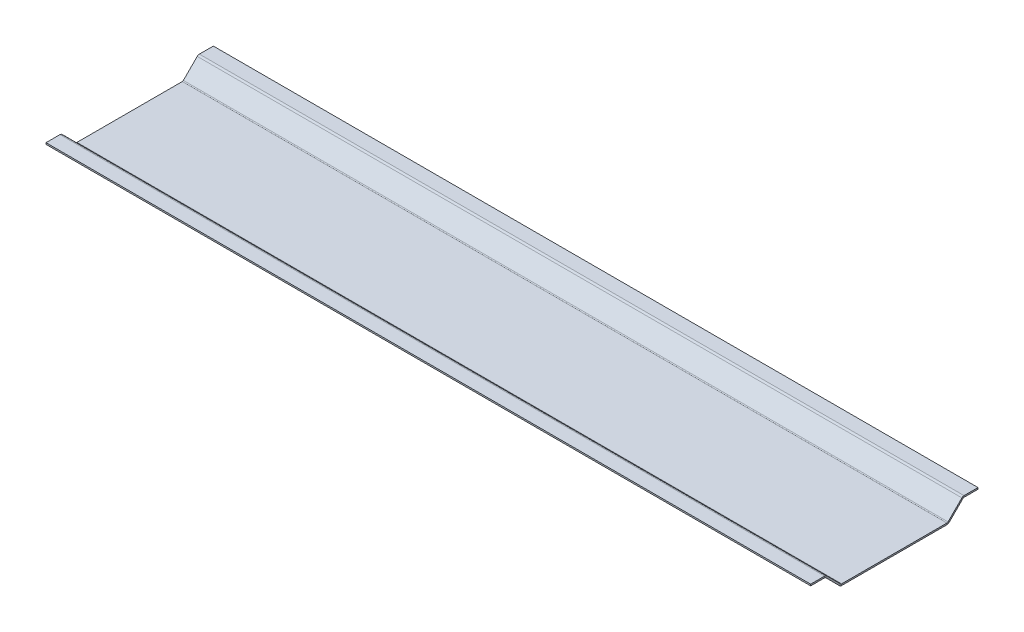
ISO-10303-21;
HEADER;
FILE_DESCRIPTION(('STEP AP214'),'2;1');
FILE_NAME('part.step','',(''),(''),'','','');
FILE_SCHEMA(('AUTOMOTIVE_DESIGN { 1 0 10303 214 1 1 1 1 }'));
ENDSEC;
DATA;
#1=APPLICATION_CONTEXT('core data for automotive mechanical design processes');
#2=APPLICATION_PROTOCOL_DEFINITION('international standard','automotive_design',2000,#1);
#3=PRODUCT_CONTEXT('',#1,'mechanical');
#4=PRODUCT('Part','Part','',(#3));
#5=PRODUCT_RELATED_PRODUCT_CATEGORY('part','',(#4));
#6=PRODUCT_DEFINITION_FORMATION('','',#4);
#7=PRODUCT_DEFINITION_CONTEXT('part definition',#1,'design');
#8=PRODUCT_DEFINITION('design','',#6,#7);
#9=PRODUCT_DEFINITION_SHAPE('','',#8);
#10=(LENGTH_UNIT() NAMED_UNIT(*) SI_UNIT(.MILLI.,.METRE.));
#11=(NAMED_UNIT(*) PLANE_ANGLE_UNIT() SI_UNIT($,.RADIAN.));
#12=(NAMED_UNIT(*) SI_UNIT($,.STERADIAN.) SOLID_ANGLE_UNIT());
#13=UNCERTAINTY_MEASURE_WITH_UNIT(LENGTH_MEASURE(1.E-05),#10,'distance_accuracy_value','');
#14=(GEOMETRIC_REPRESENTATION_CONTEXT(3) GLOBAL_UNCERTAINTY_ASSIGNED_CONTEXT((#13)) GLOBAL_UNIT_ASSIGNED_CONTEXT((#10,
#11,#12)) REPRESENTATION_CONTEXT('',''));
#15=CARTESIAN_POINT('',(0.,0.,0.));
#16=DIRECTION('',(0.,0.,1.));
#17=DIRECTION('',(1.,0.,0.));
#18=AXIS2_PLACEMENT_3D('',#15,#16,#17);
#19=CARTESIAN_POINT('',(-494.133821974281,0.,67.5));
#20=DIRECTION('',(0.,1.,0.));
#21=DIRECTION('',(0.,0.,1.));
#22=AXIS2_PLACEMENT_3D('',#19,#20,#21);
#23=PLANE('',#22);
#24=DIRECTION('',(1.,0.,0.));
#25=VECTOR('',#24,1.);
#26=CARTESIAN_POINT('',(-494.133821974281,0.,68.7426406871193));
#27=LINE('',#26,#25);
#28=CARTESIAN_POINT('',(-377.,0.,68.7426406871193));
#29=VERTEX_POINT('',#28);
#30=CARTESIAN_POINT('',(377.,0.,68.7426406871193));
#31=VERTEX_POINT('',#30);
#32=EDGE_CURVE('E11',#29,#31,#27,.T.);
#33=ORIENTED_EDGE('',*,*,#32,.F.);
#34=DIRECTION('',(0.,0.,-1.));
#35=VECTOR('',#34,1.);
#36=CARTESIAN_POINT('',(-377.,0.,67.5));
#37=LINE('',#36,#35);
#38=CARTESIAN_POINT('',(-377.,0.,82.5));
#39=VERTEX_POINT('',#38);
#40=EDGE_CURVE('E346',#39,#29,#37,.T.);
#41=ORIENTED_EDGE('',*,*,#40,.F.);
#42=DIRECTION('',(1.,0.,0.));
#43=VECTOR('',#42,1.);
#44=CARTESIAN_POINT('',(-494.133821974281,0.,82.5));
#45=LINE('',#44,#43);
#46=CARTESIAN_POINT('',(377.,0.,82.5));
#47=VERTEX_POINT('',#46);
#48=EDGE_CURVE('E40',#39,#47,#45,.T.);
#49=ORIENTED_EDGE('',*,*,#48,.T.);
#50=DIRECTION('',(0.,0.,-1.));
#51=VECTOR('',#50,1.);
#52=CARTESIAN_POINT('',(377.,0.,67.5));
#53=LINE('',#52,#51);
#54=EDGE_CURVE('E257',#47,#31,#53,.T.);
#55=ORIENTED_EDGE('',*,*,#54,.T.);
#56=EDGE_LOOP('',(#33,#41,#49,#55));
#57=FACE_BOUND('',#56,.T.);
#58=ADVANCED_FACE('F37',(#57),#23,.T.);
#59=CARTESIAN_POINT('',(-494.133821974281,-3.,68.7426406871193));
#60=DIRECTION('',(1.,0.,0.));
#61=DIRECTION('',(0.,0.,-1.));
#62=AXIS2_PLACEMENT_3D('',#59,#60,#61);
#63=CYLINDRICAL_SURFACE('',#62,3.);
#64=DIRECTION('',(1.,0.,0.));
#65=VECTOR('',#64,1.);
#66=CARTESIAN_POINT('',(-494.133821974281,-0.878679656440352,66.6213203435596));
#67=LINE('',#66,#65);
#68=CARTESIAN_POINT('',(-377.,-0.878679656440354,66.6213203435596));
#69=VERTEX_POINT('',#68);
#70=CARTESIAN_POINT('',(377.,-0.878679656440354,66.6213203435596));
#71=VERTEX_POINT('',#70);
#72=EDGE_CURVE('E45',#69,#71,#67,.T.);
#73=ORIENTED_EDGE('',*,*,#72,.F.);
#74=CARTESIAN_POINT('',(-377.,-3.,68.7426406871193));
#75=DIRECTION('',(-1.,0.,0.));
#76=DIRECTION('',(0.,-1.,0.));
#77=AXIS2_PLACEMENT_3D('',#74,#75,#76);
#78=CIRCLE('',#77,3.);
#79=EDGE_CURVE('E329',#29,#69,#78,.T.);
#80=ORIENTED_EDGE('',*,*,#79,.F.);
#81=ORIENTED_EDGE('',*,*,#32,.T.);
#82=CARTESIAN_POINT('',(377.,-3.,68.7426406871193));
#83=DIRECTION('',(-1.,0.,0.));
#84=DIRECTION('',(0.,-1.,0.));
#85=AXIS2_PLACEMENT_3D('',#82,#83,#84);
#86=CIRCLE('',#85,3.);
#87=EDGE_CURVE('E237',#31,#71,#86,.T.);
#88=ORIENTED_EDGE('',*,*,#87,.T.);
#89=EDGE_LOOP('',(#73,#80,#81,#88));
#90=FACE_BOUND('',#89,.T.);
#91=ADVANCED_FACE('F395',(#90),#63,.T.);
#92=CARTESIAN_POINT('',(-494.133821974281,-15.,52.5));
#93=DIRECTION('',(0.,0.707106781186546,-0.707106781186549));
#94=DIRECTION('',(0.,0.707106781186549,0.707106781186546));
#95=AXIS2_PLACEMENT_3D('',#92,#93,#94);
#96=PLANE('',#95);
#97=DIRECTION('',(1.,0.,0.));
#98=VECTOR('',#97,1.);
#99=CARTESIAN_POINT('',(-494.133821974281,-14.5606601717798,52.9393398282202));
#100=LINE('',#99,#98);
#101=CARTESIAN_POINT('',(-377.,-14.5606601717798,52.9393398282202));
#102=VERTEX_POINT('',#101);
#103=CARTESIAN_POINT('',(377.,-14.5606601717798,52.9393398282202));
#104=VERTEX_POINT('',#103);
#105=EDGE_CURVE('E362',#102,#104,#100,.T.);
#106=ORIENTED_EDGE('',*,*,#105,.F.);
#107=DIRECTION('',(0.,0.707106781186549,0.707106781186546));
#108=VECTOR('',#107,1.);
#109=CARTESIAN_POINT('',(-377.,-15.,52.5));
#110=LINE('',#109,#108);
#111=EDGE_CURVE('E336',#69,#102,#110,.F.);
#112=ORIENTED_EDGE('',*,*,#111,.F.);
#113=ORIENTED_EDGE('',*,*,#72,.T.);
#114=DIRECTION('',(0.,0.707106781186549,0.707106781186546));
#115=VECTOR('',#114,1.);
#116=CARTESIAN_POINT('',(377.,-15.,52.5));
#117=LINE('',#116,#115);
#118=EDGE_CURVE('E246',#71,#104,#117,.F.);
#119=ORIENTED_EDGE('',*,*,#118,.T.);
#120=EDGE_LOOP('',(#106,#112,#113,#119));
#121=FACE_BOUND('',#120,.T.);
#122=ADVANCED_FACE('F404',(#121),#96,.T.);
#123=CARTESIAN_POINT('',(-494.133821974281,-13.5,51.8786796564404));
#124=DIRECTION('',(1.,0.,0.));
#125=DIRECTION('',(0.,0.,-1.));
#126=AXIS2_PLACEMENT_3D('',#123,#124,#125);
#127=CYLINDRICAL_SURFACE('',#126,1.5);
#128=DIRECTION('',(1.,0.,0.));
#129=VECTOR('',#128,1.);
#130=CARTESIAN_POINT('',(-494.133821974281,-15.,51.8786796564404));
#131=LINE('',#130,#129);
#132=CARTESIAN_POINT('',(-377.,-15.,51.8786796564404));
#133=VERTEX_POINT('',#132);
#134=CARTESIAN_POINT('',(377.,-15.,51.8786796564404));
#135=VERTEX_POINT('',#134);
#136=EDGE_CURVE('E364',#133,#135,#131,.T.);
#137=ORIENTED_EDGE('',*,*,#136,.F.);
#138=CARTESIAN_POINT('',(-377.,-13.5,51.8786796564404));
#139=DIRECTION('',(-1.,0.,0.));
#140=DIRECTION('',(0.,-1.,0.));
#141=AXIS2_PLACEMENT_3D('',#138,#139,#140);
#142=CIRCLE('',#141,1.5);
#143=EDGE_CURVE('E330',#102,#133,#142,.F.);
#144=ORIENTED_EDGE('',*,*,#143,.F.);
#145=ORIENTED_EDGE('',*,*,#105,.T.);
#146=CARTESIAN_POINT('',(377.,-13.5,51.8786796564404));
#147=DIRECTION('',(-1.,0.,0.));
#148=DIRECTION('',(0.,-1.,0.));
#149=AXIS2_PLACEMENT_3D('',#146,#147,#148);
#150=CIRCLE('',#149,1.5);
#151=EDGE_CURVE('E238',#104,#135,#150,.F.);
#152=ORIENTED_EDGE('',*,*,#151,.T.);
#153=EDGE_LOOP('',(#137,#144,#145,#152));
#154=FACE_BOUND('',#153,.T.);
#155=ADVANCED_FACE('F408',(#154),#127,.F.);
#156=CARTESIAN_POINT('',(-494.133821974281,-15.,0.));
#157=DIRECTION('',(0.,1.,0.));
#158=DIRECTION('',(0.,0.,1.));
#159=AXIS2_PLACEMENT_3D('',#156,#157,#158);
#160=PLANE('',#159);
#161=ORIENTED_EDGE('',*,*,#136,.T.);
#162=DIRECTION('',(0.,0.,1.));
#163=VECTOR('',#162,1.);
#164=CARTESIAN_POINT('',(377.,-15.,0.));
#165=LINE('',#164,#163);
#166=CARTESIAN_POINT('',(377.,-14.9999999999999,-51.8786796564404));
#167=VERTEX_POINT('',#166);
#168=EDGE_CURVE('E260',#135,#167,#165,.F.);
#169=ORIENTED_EDGE('',*,*,#168,.T.);
#170=DIRECTION('',(1.,0.,0.));
#171=VECTOR('',#170,1.);
#172=CARTESIAN_POINT('',(-494.133821974281,-14.9999999999999,-51.8786796564404));
#173=LINE('',#172,#171);
#174=CARTESIAN_POINT('',(-377.,-14.9999999999999,-51.8786796564404));
#175=VERTEX_POINT('',#174);
#176=EDGE_CURVE('E319',#175,#167,#173,.T.);
#177=ORIENTED_EDGE('',*,*,#176,.F.);
#178=DIRECTION('',(0.,0.,1.));
#179=VECTOR('',#178,1.);
#180=CARTESIAN_POINT('',(-377.,-15.,0.));
#181=LINE('',#180,#179);
#182=EDGE_CURVE('E349',#133,#175,#181,.F.);
#183=ORIENTED_EDGE('',*,*,#182,.F.);
#184=EDGE_LOOP('',(#161,#169,#177,#183));
#185=FACE_BOUND('',#184,.T.);
#186=ADVANCED_FACE('F425',(#185),#160,.T.);
#187=CARTESIAN_POINT('',(-494.133821974281,-16.5,0.));
#188=DIRECTION('',(0.,1.,0.));
#189=DIRECTION('',(0.,0.,1.));
#190=AXIS2_PLACEMENT_3D('',#187,#188,#189);
#191=PLANE('',#190);
#192=DIRECTION('',(0.,0.,-1.));
#193=VECTOR('',#192,1.);
#194=CARTESIAN_POINT('',(-377.,-16.5,0.));
#195=LINE('',#194,#193);
#196=CARTESIAN_POINT('',(-377.,-16.5,51.8786796564404));
#197=VERTEX_POINT('',#196);
#198=CARTESIAN_POINT('',(-377.,-16.5,-51.8786796564404));
#199=VERTEX_POINT('',#198);
#200=EDGE_CURVE('E332',#197,#199,#195,.T.);
#201=ORIENTED_EDGE('',*,*,#200,.T.);
#202=DIRECTION('',(1.,0.,0.));
#203=VECTOR('',#202,1.);
#204=CARTESIAN_POINT('',(-494.133821974281,-16.5,-51.8786796564404));
#205=LINE('',#204,#203);
#206=CARTESIAN_POINT('',(377.,-16.5,-51.8786796564404));
#207=VERTEX_POINT('',#206);
#208=EDGE_CURVE('E321',#199,#207,#205,.T.);
#209=ORIENTED_EDGE('',*,*,#208,.T.);
#210=DIRECTION('',(0.,0.,-1.));
#211=VECTOR('',#210,1.);
#212=CARTESIAN_POINT('',(377.,-16.5,0.));
#213=LINE('',#212,#211);
#214=CARTESIAN_POINT('',(377.,-16.5,51.8786796564404));
#215=VERTEX_POINT('',#214);
#216=EDGE_CURVE('E241',#215,#207,#213,.T.);
#217=ORIENTED_EDGE('',*,*,#216,.F.);
#218=DIRECTION('',(1.,0.,0.));
#219=VECTOR('',#218,1.);
#220=CARTESIAN_POINT('',(-494.133821974281,-16.5,51.8786796564404));
#221=LINE('',#220,#219);
#222=EDGE_CURVE('E366',#197,#215,#221,.T.);
#223=ORIENTED_EDGE('',*,*,#222,.F.);
#224=EDGE_LOOP('',(#201,#209,#217,#223));
#225=FACE_BOUND('',#224,.T.);
#226=ADVANCED_FACE('F454',(#225),#191,.F.);
#227=CARTESIAN_POINT('',(-494.133821974281,-13.5,51.8786796564404));
#228=DIRECTION('',(1.,0.,0.));
#229=DIRECTION('',(0.,0.,-1.));
#230=AXIS2_PLACEMENT_3D('',#227,#228,#229);
#231=CYLINDRICAL_SURFACE('',#230,3.);
#232=CARTESIAN_POINT('',(-377.,-13.5,51.8786796564404));
#233=DIRECTION('',(1.,0.,0.));
#234=DIRECTION('',(0.,1.,0.));
#235=AXIS2_PLACEMENT_3D('',#232,#233,#234);
#236=CIRCLE('',#235,3.);
#237=CARTESIAN_POINT('',(-377.,-15.6213203435597,54.));
#238=VERTEX_POINT('',#237);
#239=EDGE_CURVE('E314',#238,#197,#236,.T.);
#240=ORIENTED_EDGE('',*,*,#239,.T.);
#241=ORIENTED_EDGE('',*,*,#222,.T.);
#242=CARTESIAN_POINT('',(377.,-13.5,51.8786796564404));
#243=DIRECTION('',(1.,0.,0.));
#244=DIRECTION('',(0.,1.,0.));
#245=AXIS2_PLACEMENT_3D('',#242,#243,#244);
#246=CIRCLE('',#245,3.);
#247=CARTESIAN_POINT('',(377.,-15.6213203435597,54.));
#248=VERTEX_POINT('',#247);
#249=EDGE_CURVE('E231',#248,#215,#246,.T.);
#250=ORIENTED_EDGE('',*,*,#249,.F.);
#251=DIRECTION('',(1.,0.,0.));
#252=VECTOR('',#251,1.);
#253=CARTESIAN_POINT('',(-494.133821974281,-15.6213203435597,54.));
#254=LINE('',#253,#252);
#255=EDGE_CURVE('E368',#238,#248,#254,.T.);
#256=ORIENTED_EDGE('',*,*,#255,.F.);
#257=EDGE_LOOP('',(#240,#241,#250,#256));
#258=FACE_BOUND('',#257,.T.);
#259=ADVANCED_FACE('F459',(#258),#231,.T.);
#260=CARTESIAN_POINT('',(-494.133821974281,-16.0606601717798,53.5606601717798));
#261=DIRECTION('',(0.,0.707106781186547,-0.707106781186549));
#262=DIRECTION('',(0.,0.707106781186549,0.707106781186546));
#263=AXIS2_PLACEMENT_3D('',#260,#261,#262);
#264=PLANE('',#263);
#265=DIRECTION('',(0.,-0.707106781186549,-0.707106781186546));
#266=VECTOR('',#265,1.);
#267=CARTESIAN_POINT('',(-377.,-16.06066017178,53.5606601717797));
#268=LINE('',#267,#266);
#269=CARTESIAN_POINT('',(-377.,-1.93933982822017,67.6819805153395));
#270=VERTEX_POINT('',#269);
#271=EDGE_CURVE('E339',#270,#238,#268,.T.);
#272=ORIENTED_EDGE('',*,*,#271,.T.);
#273=ORIENTED_EDGE('',*,*,#255,.T.);
#274=DIRECTION('',(0.,-0.707106781186549,-0.707106781186546));
#275=VECTOR('',#274,1.);
#276=CARTESIAN_POINT('',(377.,-16.06066017178,53.5606601717797));
#277=LINE('',#276,#275);
#278=CARTESIAN_POINT('',(377.,-1.93933982822017,67.6819805153395));
#279=VERTEX_POINT('',#278);
#280=EDGE_CURVE('E250',#279,#248,#277,.T.);
#281=ORIENTED_EDGE('',*,*,#280,.F.);
#282=DIRECTION('',(1.,0.,0.));
#283=VECTOR('',#282,1.);
#284=CARTESIAN_POINT('',(-494.133821974281,-1.93933982822018,67.6819805153395));
#285=LINE('',#284,#283);
#286=EDGE_CURVE('E370',#270,#279,#285,.T.);
#287=ORIENTED_EDGE('',*,*,#286,.F.);
#288=EDGE_LOOP('',(#272,#273,#281,#287));
#289=FACE_BOUND('',#288,.T.);
#290=ADVANCED_FACE('F464',(#289),#264,.F.);
#291=CARTESIAN_POINT('',(-494.133821974281,-3.,68.7426406871193));
#292=DIRECTION('',(1.,0.,0.));
#293=DIRECTION('',(0.,0.,-1.));
#294=AXIS2_PLACEMENT_3D('',#291,#292,#293);
#295=CYLINDRICAL_SURFACE('',#294,1.5);
#296=CARTESIAN_POINT('',(-377.,-3.,68.7426406871193));
#297=DIRECTION('',(1.,0.,0.));
#298=DIRECTION('',(0.,1.,0.));
#299=AXIS2_PLACEMENT_3D('',#296,#297,#298);
#300=CIRCLE('',#299,1.5);
#301=CARTESIAN_POINT('',(-377.,-1.5,68.7426406871193));
#302=VERTEX_POINT('',#301);
#303=EDGE_CURVE('E62',#302,#270,#300,.F.);
#304=ORIENTED_EDGE('',*,*,#303,.T.);
#305=ORIENTED_EDGE('',*,*,#286,.T.);
#306=CARTESIAN_POINT('',(377.,-3.,68.7426406871193));
#307=DIRECTION('',(1.,0.,0.));
#308=DIRECTION('',(0.,1.,0.));
#309=AXIS2_PLACEMENT_3D('',#306,#307,#308);
#310=CIRCLE('',#309,1.5);
#311=CARTESIAN_POINT('',(377.,-1.5,68.7426406871193));
#312=VERTEX_POINT('',#311);
#313=EDGE_CURVE('E234',#312,#279,#310,.F.);
#314=ORIENTED_EDGE('',*,*,#313,.F.);
#315=DIRECTION('',(1.,0.,0.));
#316=VECTOR('',#315,1.);
#317=CARTESIAN_POINT('',(-494.133821974281,-1.5,68.7426406871193));
#318=LINE('',#317,#316);
#319=EDGE_CURVE('E372',#302,#312,#318,.T.);
#320=ORIENTED_EDGE('',*,*,#319,.F.);
#321=EDGE_LOOP('',(#304,#305,#314,#320));
#322=FACE_BOUND('',#321,.T.);
#323=ADVANCED_FACE('F466',(#322),#295,.F.);
#324=CARTESIAN_POINT('',(-494.133821974281,-1.5,67.5));
#325=DIRECTION('',(0.,1.,0.));
#326=DIRECTION('',(0.,0.,1.));
#327=AXIS2_PLACEMENT_3D('',#324,#325,#326);
#328=PLANE('',#327);
#329=DIRECTION('',(0.,0.,1.));
#330=VECTOR('',#329,1.);
#331=CARTESIAN_POINT('',(-377.,-1.5,67.5));
#332=LINE('',#331,#330);
#333=CARTESIAN_POINT('',(-377.,-1.5,82.5));
#334=VERTEX_POINT('',#333);
#335=EDGE_CURVE('E53',#334,#302,#332,.F.);
#336=ORIENTED_EDGE('',*,*,#335,.T.);
#337=ORIENTED_EDGE('',*,*,#319,.T.);
#338=DIRECTION('',(0.,0.,1.));
#339=VECTOR('',#338,1.);
#340=CARTESIAN_POINT('',(377.,-1.5,67.5));
#341=LINE('',#340,#339);
#342=CARTESIAN_POINT('',(377.,-1.5,82.5));
#343=VERTEX_POINT('',#342);
#344=EDGE_CURVE('E267',#343,#312,#341,.F.);
#345=ORIENTED_EDGE('',*,*,#344,.F.);
#346=DIRECTION('',(1.,0.,0.));
#347=VECTOR('',#346,1.);
#348=CARTESIAN_POINT('',(-494.133821974281,-1.5,82.5));
#349=LINE('',#348,#347);
#350=EDGE_CURVE('E373',#334,#343,#349,.T.);
#351=ORIENTED_EDGE('',*,*,#350,.F.);
#352=EDGE_LOOP('',(#336,#337,#345,#351));
#353=FACE_BOUND('',#352,.T.);
#354=ADVANCED_FACE('F469',(#353),#328,.F.);
#355=CARTESIAN_POINT('',(-494.133821974281,-1.5,82.5));
#356=DIRECTION('',(0.,0.,-1.));
#357=DIRECTION('',(-1.,0.,0.));
#358=AXIS2_PLACEMENT_3D('',#355,#356,#357);
#359=PLANE('',#358);
#360=DIRECTION('',(0.,1.,0.));
#361=VECTOR('',#360,1.);
#362=CARTESIAN_POINT('',(-377.,0.,82.5));
#363=LINE('',#362,#361);
#364=EDGE_CURVE('E355',#39,#334,#363,.F.);
#365=ORIENTED_EDGE('',*,*,#364,.T.);
#366=ORIENTED_EDGE('',*,*,#350,.T.);
#367=DIRECTION('',(0.,1.,0.));
#368=VECTOR('',#367,1.);
#369=CARTESIAN_POINT('',(377.,0.,82.5));
#370=LINE('',#369,#368);
#371=EDGE_CURVE('E270',#47,#343,#370,.F.);
#372=ORIENTED_EDGE('',*,*,#371,.F.);
#373=ORIENTED_EDGE('',*,*,#48,.F.);
#374=EDGE_LOOP('',(#365,#366,#372,#373));
#375=FACE_BOUND('',#374,.T.);
#376=ADVANCED_FACE('F382',(#375),#359,.F.);
#377=CARTESIAN_POINT('',(-377.,0.,67.5));
#378=DIRECTION('',(1.,0.,0.));
#379=DIRECTION('',(0.,0.,-1.));
#380=AXIS2_PLACEMENT_3D('',#377,#378,#379);
#381=PLANE('',#380);
#382=ORIENTED_EDGE('',*,*,#40,.T.);
#383=DIRECTION('',(0.,1.,0.));
#384=VECTOR('',#383,1.);
#385=CARTESIAN_POINT('',(-377.,0.,68.7426406871193));
#386=LINE('',#385,#384);
#387=EDGE_CURVE('E358',#29,#302,#386,.F.);
#388=ORIENTED_EDGE('',*,*,#387,.T.);
#389=ORIENTED_EDGE('',*,*,#335,.F.);
#390=ORIENTED_EDGE('',*,*,#364,.F.);
#391=EDGE_LOOP('',(#382,#388,#389,#390));
#392=FACE_BOUND('',#391,.T.);
#393=ADVANCED_FACE('F476',(#392),#381,.F.);
#394=CARTESIAN_POINT('',(-377.,-16.5,0.));
#395=DIRECTION('',(1.,0.,0.));
#396=DIRECTION('',(0.,0.,-1.));
#397=AXIS2_PLACEMENT_3D('',#394,#395,#396);
#398=PLANE('',#397);
#399=ORIENTED_EDGE('',*,*,#182,.T.);
#400=DIRECTION('',(0.,-1.,0.));
#401=VECTOR('',#400,1.);
#402=CARTESIAN_POINT('',(-377.,-16.5,-51.8786796564404));
#403=LINE('',#402,#401);
#404=EDGE_CURVE('E286',#199,#175,#403,.F.);
#405=ORIENTED_EDGE('',*,*,#404,.F.);
#406=ORIENTED_EDGE('',*,*,#200,.F.);
#407=DIRECTION('',(0.,-1.,0.));
#408=VECTOR('',#407,1.);
#409=CARTESIAN_POINT('',(-377.,-16.5,51.8786796564404));
#410=LINE('',#409,#408);
#411=EDGE_CURVE('E342',#197,#133,#410,.F.);
#412=ORIENTED_EDGE('',*,*,#411,.T.);
#413=EDGE_LOOP('',(#399,#405,#406,#412));
#414=FACE_BOUND('',#413,.T.);
#415=ADVANCED_FACE('F429',(#414),#398,.F.);
#416=CARTESIAN_POINT('',(-377.,-13.5,51.8786796564404));
#417=DIRECTION('',(-1.,0.,0.));
#418=DIRECTION('',(0.,-1.,0.));
#419=AXIS2_PLACEMENT_3D('',#416,#417,#418);
#420=PLANE('',#419);
#421=ORIENTED_EDGE('',*,*,#143,.T.);
#422=ORIENTED_EDGE('',*,*,#411,.F.);
#423=ORIENTED_EDGE('',*,*,#239,.F.);
#424=DIRECTION('',(0.,-0.707106781186547,0.707106781186549));
#425=VECTOR('',#424,1.);
#426=CARTESIAN_POINT('',(-377.,-15.6213203435597,54.));
#427=LINE('',#426,#425);
#428=EDGE_CURVE('E343',#238,#102,#427,.F.);
#429=ORIENTED_EDGE('',*,*,#428,.T.);
#430=EDGE_LOOP('',(#421,#422,#423,#429));
#431=FACE_BOUND('',#430,.T.);
#432=ADVANCED_FACE('F461',(#431),#420,.T.);
#433=CARTESIAN_POINT('',(-377.,-16.06066017178,53.5606601717797));
#434=DIRECTION('',(1.,0.,0.));
#435=DIRECTION('',(0.,-0.707106781186549,-0.707106781186546));
#436=AXIS2_PLACEMENT_3D('',#433,#434,#435);
#437=PLANE('',#436);
#438=ORIENTED_EDGE('',*,*,#428,.F.);
#439=ORIENTED_EDGE('',*,*,#271,.F.);
#440=DIRECTION('',(0.,-0.707106781186547,0.707106781186549));
#441=VECTOR('',#440,1.);
#442=CARTESIAN_POINT('',(-377.,-1.93933982822017,67.6819805153395));
#443=LINE('',#442,#441);
#444=EDGE_CURVE('E338',#270,#69,#443,.F.);
#445=ORIENTED_EDGE('',*,*,#444,.T.);
#446=ORIENTED_EDGE('',*,*,#111,.T.);
#447=EDGE_LOOP('',(#438,#439,#445,#446));
#448=FACE_BOUND('',#447,.T.);
#449=ADVANCED_FACE('F401',(#448),#437,.F.);
#450=CARTESIAN_POINT('',(-377.,-3.,68.7426406871193));
#451=DIRECTION('',(-1.,0.,0.));
#452=DIRECTION('',(0.,-1.,0.));
#453=AXIS2_PLACEMENT_3D('',#450,#451,#452);
#454=PLANE('',#453);
#455=ORIENTED_EDGE('',*,*,#79,.T.);
#456=ORIENTED_EDGE('',*,*,#444,.F.);
#457=ORIENTED_EDGE('',*,*,#303,.F.);
#458=ORIENTED_EDGE('',*,*,#387,.F.);
#459=EDGE_LOOP('',(#455,#456,#457,#458));
#460=FACE_BOUND('',#459,.T.);
#461=ADVANCED_FACE('F397',(#460),#454,.T.);
#462=CARTESIAN_POINT('',(-494.133821974281,0.,-67.5));
#463=DIRECTION('',(0.,1.,0.));
#464=DIRECTION('',(0.,0.,-1.));
#465=AXIS2_PLACEMENT_3D('',#462,#463,#464);
#466=PLANE('',#465);
#467=DIRECTION('',(1.,0.,0.));
#468=VECTOR('',#467,1.);
#469=CARTESIAN_POINT('',(-494.133821974281,0.,-68.7426406871193));
#470=LINE('',#469,#468);
#471=CARTESIAN_POINT('',(-377.,0.,-68.7426406871193));
#472=VERTEX_POINT('',#471);
#473=CARTESIAN_POINT('',(377.,0.,-68.7426406871193));
#474=VERTEX_POINT('',#473);
#475=EDGE_CURVE('E312',#472,#474,#470,.T.);
#476=ORIENTED_EDGE('',*,*,#475,.T.);
#477=DIRECTION('',(0.,0.,1.));
#478=VECTOR('',#477,1.);
#479=CARTESIAN_POINT('',(377.,0.,-67.5));
#480=LINE('',#479,#478);
#481=CARTESIAN_POINT('',(377.,1.08121276247753E-13,-82.5));
#482=VERTEX_POINT('',#481);
#483=EDGE_CURVE('E221',#482,#474,#480,.T.);
#484=ORIENTED_EDGE('',*,*,#483,.F.);
#485=DIRECTION('',(1.,0.,0.));
#486=VECTOR('',#485,1.);
#487=CARTESIAN_POINT('',(-494.133821974281,1.08121276247753E-13,-82.5));
#488=LINE('',#487,#486);
#489=CARTESIAN_POINT('',(-377.,1.08121276247753E-13,-82.5));
#490=VERTEX_POINT('',#489);
#491=EDGE_CURVE('E310',#490,#482,#488,.T.);
#492=ORIENTED_EDGE('',*,*,#491,.F.);
#493=DIRECTION('',(0.,0.,1.));
#494=VECTOR('',#493,1.);
#495=CARTESIAN_POINT('',(-377.,0.,-67.5));
#496=LINE('',#495,#494);
#497=EDGE_CURVE('E298',#490,#472,#496,.T.);
#498=ORIENTED_EDGE('',*,*,#497,.T.);
#499=EDGE_LOOP('',(#476,#484,#492,#498));
#500=FACE_BOUND('',#499,.T.);
#501=ADVANCED_FACE('F528',(#500),#466,.T.);
#502=CARTESIAN_POINT('',(-494.133821974281,-2.99999999999991,-68.7426406871193));
#503=DIRECTION('',(1.,0.,0.));
#504=DIRECTION('',(0.,0.,1.));
#505=AXIS2_PLACEMENT_3D('',#502,#503,#504);
#506=CYLINDRICAL_SURFACE('',#505,3.);
#507=DIRECTION('',(1.,0.,0.));
#508=VECTOR('',#507,1.);
#509=CARTESIAN_POINT('',(-494.133821974281,-0.878679656440264,-66.6213203435596));
#510=LINE('',#509,#508);
#511=CARTESIAN_POINT('',(-377.,-0.878679656440266,-66.6213203435596));
#512=VERTEX_POINT('',#511);
#513=CARTESIAN_POINT('',(377.,-0.878679656440266,-66.6213203435596));
#514=VERTEX_POINT('',#513);
#515=EDGE_CURVE('E315',#512,#514,#510,.T.);
#516=ORIENTED_EDGE('',*,*,#515,.T.);
#517=CARTESIAN_POINT('',(377.,-2.99999999999991,-68.7426406871193));
#518=DIRECTION('',(1.,0.,0.));
#519=DIRECTION('',(0.,-1.,0.));
#520=AXIS2_PLACEMENT_3D('',#517,#518,#519);
#521=CIRCLE('',#520,3.);
#522=EDGE_CURVE('E199',#474,#514,#521,.T.);
#523=ORIENTED_EDGE('',*,*,#522,.F.);
#524=ORIENTED_EDGE('',*,*,#475,.F.);
#525=CARTESIAN_POINT('',(-377.,-2.99999999999991,-68.7426406871193));
#526=DIRECTION('',(1.,0.,0.));
#527=DIRECTION('',(0.,-1.,0.));
#528=AXIS2_PLACEMENT_3D('',#525,#526,#527);
#529=CIRCLE('',#528,3.);
#530=EDGE_CURVE('E282',#472,#512,#529,.T.);
#531=ORIENTED_EDGE('',*,*,#530,.T.);
#532=EDGE_LOOP('',(#516,#523,#524,#531));
#533=FACE_BOUND('',#532,.T.);
#534=ADVANCED_FACE('F532',(#533),#506,.T.);
#535=CARTESIAN_POINT('',(-494.133821974281,-14.9999999999999,-52.5));
#536=DIRECTION('',(0.,0.707106781186546,0.70710678118655));
#537=DIRECTION('',(0.,0.70710678118655,-0.707106781186546));
#538=AXIS2_PLACEMENT_3D('',#535,#536,#537);
#539=PLANE('',#538);
#540=DIRECTION('',(1.,0.,0.));
#541=VECTOR('',#540,1.);
#542=CARTESIAN_POINT('',(-494.133821974281,-14.5606601717798,-52.9393398282202));
#543=LINE('',#542,#541);
#544=CARTESIAN_POINT('',(-377.,-14.5606601717798,-52.9393398282202));
#545=VERTEX_POINT('',#544);
#546=CARTESIAN_POINT('',(377.,-14.5606601717798,-52.9393398282202));
#547=VERTEX_POINT('',#546);
#548=EDGE_CURVE('E317',#545,#547,#543,.T.);
#549=ORIENTED_EDGE('',*,*,#548,.T.);
#550=DIRECTION('',(0.,0.707106781186549,-0.707106781186546));
#551=VECTOR('',#550,1.);
#552=CARTESIAN_POINT('',(377.,-14.9999999999999,-52.5));
#553=LINE('',#552,#551);
#554=EDGE_CURVE('E204',#514,#547,#553,.F.);
#555=ORIENTED_EDGE('',*,*,#554,.F.);
#556=ORIENTED_EDGE('',*,*,#515,.F.);
#557=DIRECTION('',(0.,0.707106781186549,-0.707106781186546));
#558=VECTOR('',#557,1.);
#559=CARTESIAN_POINT('',(-377.,-14.9999999999999,-52.5));
#560=LINE('',#559,#558);
#561=EDGE_CURVE('E291',#512,#545,#560,.F.);
#562=ORIENTED_EDGE('',*,*,#561,.T.);
#563=EDGE_LOOP('',(#549,#555,#556,#562));
#564=FACE_BOUND('',#563,.T.);
#565=ADVANCED_FACE('F442',(#564),#539,.T.);
#566=CARTESIAN_POINT('',(-494.133821974281,-13.4999999999999,-51.8786796564404));
#567=DIRECTION('',(1.,0.,0.));
#568=DIRECTION('',(0.,0.,1.));
#569=AXIS2_PLACEMENT_3D('',#566,#567,#568);
#570=CYLINDRICAL_SURFACE('',#569,1.5);
#571=ORIENTED_EDGE('',*,*,#176,.T.);
#572=CARTESIAN_POINT('',(377.,-13.4999999999999,-51.8786796564404));
#573=DIRECTION('',(1.,0.,0.));
#574=DIRECTION('',(0.,-1.,0.));
#575=AXIS2_PLACEMENT_3D('',#572,#573,#574);
#576=CIRCLE('',#575,1.5);
#577=EDGE_CURVE('E209',#547,#167,#576,.F.);
#578=ORIENTED_EDGE('',*,*,#577,.F.);
#579=ORIENTED_EDGE('',*,*,#548,.F.);
#580=CARTESIAN_POINT('',(-377.,-13.4999999999999,-51.8786796564404));
#581=DIRECTION('',(1.,0.,0.));
#582=DIRECTION('',(0.,-1.,0.));
#583=AXIS2_PLACEMENT_3D('',#580,#581,#582);
#584=CIRCLE('',#583,1.5);
#585=EDGE_CURVE('E283',#545,#175,#584,.F.);
#586=ORIENTED_EDGE('',*,*,#585,.T.);
#587=EDGE_LOOP('',(#571,#578,#579,#586));
#588=FACE_BOUND('',#587,.T.);
#589=ADVANCED_FACE('F438',(#588),#570,.F.);
#590=CARTESIAN_POINT('',(-494.133821974281,-13.4999999999999,-51.8786796564404));
#591=DIRECTION('',(1.,0.,0.));
#592=DIRECTION('',(0.,0.,1.));
#593=AXIS2_PLACEMENT_3D('',#590,#591,#592);
#594=CYLINDRICAL_SURFACE('',#593,3.);
#595=CARTESIAN_POINT('',(-377.,-13.4999999999999,-51.8786796564404));
#596=DIRECTION('',(-1.,0.,0.));
#597=DIRECTION('',(0.,1.,0.));
#598=AXIS2_PLACEMENT_3D('',#595,#596,#597);
#599=CIRCLE('',#598,3.);
#600=CARTESIAN_POINT('',(-377.,-15.6213203435596,-54.));
#601=VERTEX_POINT('',#600);
#602=EDGE_CURVE('E276',#601,#199,#599,.T.);
#603=ORIENTED_EDGE('',*,*,#602,.F.);
#604=DIRECTION('',(1.,0.,0.));
#605=VECTOR('',#604,1.);
#606=CARTESIAN_POINT('',(-494.133821974281,-15.6213203435596,-54.));
#607=LINE('',#606,#605);
#608=CARTESIAN_POINT('',(377.,-15.6213203435596,-54.));
#609=VERTEX_POINT('',#608);
#610=EDGE_CURVE('E187',#601,#609,#607,.T.);
#611=ORIENTED_EDGE('',*,*,#610,.T.);
#612=CARTESIAN_POINT('',(377.,-13.4999999999999,-51.8786796564404));
#613=DIRECTION('',(-1.,0.,0.));
#614=DIRECTION('',(0.,1.,0.));
#615=AXIS2_PLACEMENT_3D('',#612,#613,#614);
#616=CIRCLE('',#615,3.);
#617=EDGE_CURVE('E448',#609,#207,#616,.T.);
#618=ORIENTED_EDGE('',*,*,#617,.T.);
#619=ORIENTED_EDGE('',*,*,#208,.F.);
#620=EDGE_LOOP('',(#603,#611,#618,#619));
#621=FACE_BOUND('',#620,.T.);
#622=ADVANCED_FACE('F452',(#621),#594,.T.);
#623=CARTESIAN_POINT('',(-494.133821974281,-16.0606601717798,-53.5606601717799));
#624=DIRECTION('',(0.,0.707106781186546,0.70710678118655));
#625=DIRECTION('',(0.,0.707106781186549,-0.707106781186546));
#626=AXIS2_PLACEMENT_3D('',#623,#624,#625);
#627=PLANE('',#626);
#628=DIRECTION('',(0.,-0.707106781186549,0.707106781186546));
#629=VECTOR('',#628,1.);
#630=CARTESIAN_POINT('',(-377.,-16.0606601717799,-53.5606601717797));
#631=LINE('',#630,#629);
#632=CARTESIAN_POINT('',(-377.,-1.93933982822008,-67.6819805153395));
#633=VERTEX_POINT('',#632);
#634=EDGE_CURVE('E183',#633,#601,#631,.T.);
#635=ORIENTED_EDGE('',*,*,#634,.F.);
#636=DIRECTION('',(1.,0.,0.));
#637=VECTOR('',#636,1.);
#638=CARTESIAN_POINT('',(-494.133821974281,-1.93933982822009,-67.6819805153395));
#639=LINE('',#638,#637);
#640=CARTESIAN_POINT('',(377.,-1.93933982822008,-67.6819805153395));
#641=VERTEX_POINT('',#640);
#642=EDGE_CURVE('E175',#633,#641,#639,.T.);
#643=ORIENTED_EDGE('',*,*,#642,.T.);
#644=DIRECTION('',(0.,-0.707106781186549,0.707106781186546));
#645=VECTOR('',#644,1.);
#646=CARTESIAN_POINT('',(377.,-16.0606601717799,-53.5606601717797));
#647=LINE('',#646,#645);
#648=EDGE_CURVE('E180',#641,#609,#647,.T.);
#649=ORIENTED_EDGE('',*,*,#648,.T.);
#650=ORIENTED_EDGE('',*,*,#610,.F.);
#651=EDGE_LOOP('',(#635,#643,#649,#650));
#652=FACE_BOUND('',#651,.T.);
#653=ADVANCED_FACE('F177',(#652),#627,.F.);
#654=CARTESIAN_POINT('',(-494.133821974281,-2.99999999999991,-68.7426406871193));
#655=DIRECTION('',(1.,0.,0.));
#656=DIRECTION('',(0.,0.,1.));
#657=AXIS2_PLACEMENT_3D('',#654,#655,#656);
#658=CYLINDRICAL_SURFACE('',#657,1.5);
#659=CARTESIAN_POINT('',(-377.,-2.99999999999991,-68.7426406871193));
#660=DIRECTION('',(-1.,0.,0.));
#661=DIRECTION('',(0.,1.,0.));
#662=AXIS2_PLACEMENT_3D('',#659,#660,#661);
#663=CIRCLE('',#662,1.5);
#664=CARTESIAN_POINT('',(-377.,-1.49999999999991,-68.7426406871193));
#665=VERTEX_POINT('',#664);
#666=EDGE_CURVE('E279',#665,#633,#663,.F.);
#667=ORIENTED_EDGE('',*,*,#666,.F.);
#668=DIRECTION('',(1.,0.,0.));
#669=VECTOR('',#668,1.);
#670=CARTESIAN_POINT('',(-494.133821974281,-1.49999999999991,-68.7426406871193));
#671=LINE('',#670,#669);
#672=CARTESIAN_POINT('',(377.,-1.49999999999991,-68.7426406871193));
#673=VERTEX_POINT('',#672);
#674=EDGE_CURVE('E188',#665,#673,#671,.T.);
#675=ORIENTED_EDGE('',*,*,#674,.T.);
#676=CARTESIAN_POINT('',(377.,-2.99999999999991,-68.7426406871193));
#677=DIRECTION('',(-1.,0.,0.));
#678=DIRECTION('',(0.,1.,0.));
#679=AXIS2_PLACEMENT_3D('',#676,#677,#678);
#680=CIRCLE('',#679,1.5);
#681=EDGE_CURVE('E197',#673,#641,#680,.F.);
#682=ORIENTED_EDGE('',*,*,#681,.T.);
#683=ORIENTED_EDGE('',*,*,#642,.F.);
#684=EDGE_LOOP('',(#667,#675,#682,#683));
#685=FACE_BOUND('',#684,.T.);
#686=ADVANCED_FACE('F206',(#685),#658,.F.);
#687=CARTESIAN_POINT('',(-494.133821974281,-1.49999999999991,-67.5));
#688=DIRECTION('',(0.,1.,0.));
#689=DIRECTION('',(0.,0.,-1.));
#690=AXIS2_PLACEMENT_3D('',#687,#688,#689);
#691=PLANE('',#690);
#692=DIRECTION('',(0.,0.,-1.));
#693=VECTOR('',#692,1.);
#694=CARTESIAN_POINT('',(-377.,-1.49999999999991,-67.5));
#695=LINE('',#694,#693);
#696=CARTESIAN_POINT('',(-377.,-1.49999999999989,-82.5));
#697=VERTEX_POINT('',#696);
#698=EDGE_CURVE('E302',#697,#665,#695,.F.);
#699=ORIENTED_EDGE('',*,*,#698,.F.);
#700=DIRECTION('',(1.,0.,0.));
#701=VECTOR('',#700,1.);
#702=CARTESIAN_POINT('',(-494.133821974281,-1.49999999999989,-82.5));
#703=LINE('',#702,#701);
#704=CARTESIAN_POINT('',(377.,-1.49999999999989,-82.5));
#705=VERTEX_POINT('',#704);
#706=EDGE_CURVE('E325',#697,#705,#703,.T.);
#707=ORIENTED_EDGE('',*,*,#706,.T.);
#708=DIRECTION('',(0.,0.,-1.));
#709=VECTOR('',#708,1.);
#710=CARTESIAN_POINT('',(377.,-1.49999999999991,-67.5));
#711=LINE('',#710,#709);
#712=EDGE_CURVE('E223',#705,#673,#711,.F.);
#713=ORIENTED_EDGE('',*,*,#712,.T.);
#714=ORIENTED_EDGE('',*,*,#674,.F.);
#715=EDGE_LOOP('',(#699,#707,#713,#714));
#716=FACE_BOUND('',#715,.T.);
#717=ADVANCED_FACE('F590',(#716),#691,.F.);
#718=CARTESIAN_POINT('',(-494.133821974281,-1.49999999999989,-82.5));
#719=DIRECTION('',(0.,0.,1.));
#720=DIRECTION('',(-1.,0.,0.));
#721=AXIS2_PLACEMENT_3D('',#718,#719,#720);
#722=PLANE('',#721);
#723=DIRECTION('',(0.,1.,0.));
#724=VECTOR('',#723,1.);
#725=CARTESIAN_POINT('',(-377.,1.08121276247753E-13,-82.5));
#726=LINE('',#725,#724);
#727=EDGE_CURVE('E305',#490,#697,#726,.F.);
#728=ORIENTED_EDGE('',*,*,#727,.F.);
#729=ORIENTED_EDGE('',*,*,#491,.T.);
#730=DIRECTION('',(0.,1.,0.));
#731=VECTOR('',#730,1.);
#732=CARTESIAN_POINT('',(377.,1.08121276247753E-13,-82.5));
#733=LINE('',#732,#731);
#734=EDGE_CURVE('E226',#482,#705,#733,.F.);
#735=ORIENTED_EDGE('',*,*,#734,.T.);
#736=ORIENTED_EDGE('',*,*,#706,.F.);
#737=EDGE_LOOP('',(#728,#729,#735,#736));
#738=FACE_BOUND('',#737,.T.);
#739=ADVANCED_FACE('F599',(#738),#722,.F.);
#740=CARTESIAN_POINT('',(-377.,0.,-67.5));
#741=DIRECTION('',(1.,0.,0.));
#742=DIRECTION('',(0.,0.,1.));
#743=AXIS2_PLACEMENT_3D('',#740,#741,#742);
#744=PLANE('',#743);
#745=ORIENTED_EDGE('',*,*,#497,.F.);
#746=ORIENTED_EDGE('',*,*,#727,.T.);
#747=ORIENTED_EDGE('',*,*,#698,.T.);
#748=DIRECTION('',(0.,1.,0.));
#749=VECTOR('',#748,1.);
#750=CARTESIAN_POINT('',(-377.,0.,-68.7426406871193));
#751=LINE('',#750,#749);
#752=EDGE_CURVE('E308',#472,#665,#751,.F.);
#753=ORIENTED_EDGE('',*,*,#752,.F.);
#754=EDGE_LOOP('',(#745,#746,#747,#753));
#755=FACE_BOUND('',#754,.T.);
#756=ADVANCED_FACE('F609',(#755),#744,.F.);
#757=CARTESIAN_POINT('',(-377.,-13.4999999999999,-51.8786796564404));
#758=DIRECTION('',(-1.,0.,0.));
#759=DIRECTION('',(0.,-1.,0.));
#760=AXIS2_PLACEMENT_3D('',#757,#758,#759);
#761=PLANE('',#760);
#762=ORIENTED_EDGE('',*,*,#585,.F.);
#763=DIRECTION('',(0.,-0.707106781186546,-0.70710678118655));
#764=VECTOR('',#763,1.);
#765=CARTESIAN_POINT('',(-377.,-15.6213203435596,-54.));
#766=LINE('',#765,#764);
#767=EDGE_CURVE('E296',#601,#545,#766,.F.);
#768=ORIENTED_EDGE('',*,*,#767,.F.);
#769=ORIENTED_EDGE('',*,*,#602,.T.);
#770=ORIENTED_EDGE('',*,*,#404,.T.);
#771=EDGE_LOOP('',(#762,#768,#769,#770));
#772=FACE_BOUND('',#771,.T.);
#773=ADVANCED_FACE('F433',(#772),#761,.T.);
#774=CARTESIAN_POINT('',(-377.,-16.0606601717799,-53.5606601717797));
#775=DIRECTION('',(1.,0.,0.));
#776=DIRECTION('',(0.,-0.707106781186549,0.707106781186546));
#777=AXIS2_PLACEMENT_3D('',#774,#775,#776);
#778=PLANE('',#777);
#779=ORIENTED_EDGE('',*,*,#767,.T.);
#780=ORIENTED_EDGE('',*,*,#561,.F.);
#781=DIRECTION('',(0.,-0.707106781186546,-0.70710678118655));
#782=VECTOR('',#781,1.);
#783=CARTESIAN_POINT('',(-377.,-1.93933982822008,-67.6819805153395));
#784=LINE('',#783,#782);
#785=EDGE_CURVE('E294',#633,#512,#784,.F.);
#786=ORIENTED_EDGE('',*,*,#785,.F.);
#787=ORIENTED_EDGE('',*,*,#634,.T.);
#788=EDGE_LOOP('',(#779,#780,#786,#787));
#789=FACE_BOUND('',#788,.T.);
#790=ADVANCED_FACE('F859',(#789),#778,.F.);
#791=CARTESIAN_POINT('',(-377.,-2.99999999999991,-68.7426406871193));
#792=DIRECTION('',(-1.,0.,0.));
#793=DIRECTION('',(0.,-1.,0.));
#794=AXIS2_PLACEMENT_3D('',#791,#792,#793);
#795=PLANE('',#794);
#796=ORIENTED_EDGE('',*,*,#530,.F.);
#797=ORIENTED_EDGE('',*,*,#752,.T.);
#798=ORIENTED_EDGE('',*,*,#666,.T.);
#799=ORIENTED_EDGE('',*,*,#785,.T.);
#800=EDGE_LOOP('',(#796,#797,#798,#799));
#801=FACE_BOUND('',#800,.T.);
#802=ADVANCED_FACE('F621',(#801),#795,.T.);
#803=CARTESIAN_POINT('',(377.,0.,67.5));
#804=DIRECTION('',(-1.,0.,0.));
#805=DIRECTION('',(0.,0.,-1.));
#806=AXIS2_PLACEMENT_3D('',#803,#804,#805);
#807=PLANE('',#806);
#808=ORIENTED_EDGE('',*,*,#54,.F.);
#809=ORIENTED_EDGE('',*,*,#371,.T.);
#810=ORIENTED_EDGE('',*,*,#344,.T.);
#811=DIRECTION('',(0.,1.,0.));
#812=VECTOR('',#811,1.);
#813=CARTESIAN_POINT('',(377.,0.,68.7426406871193));
#814=LINE('',#813,#812);
#815=EDGE_CURVE('E273',#31,#312,#814,.F.);
#816=ORIENTED_EDGE('',*,*,#815,.F.);
#817=EDGE_LOOP('',(#808,#809,#810,#816));
#818=FACE_BOUND('',#817,.T.);
#819=ADVANCED_FACE('F386',(#818),#807,.F.);
#820=CARTESIAN_POINT('',(377.,-16.5,0.));
#821=DIRECTION('',(-1.,0.,0.));
#822=DIRECTION('',(0.,0.,-1.));
#823=AXIS2_PLACEMENT_3D('',#820,#821,#822);
#824=PLANE('',#823);
#825=ORIENTED_EDGE('',*,*,#168,.F.);
#826=DIRECTION('',(0.,-1.,0.));
#827=VECTOR('',#826,1.);
#828=CARTESIAN_POINT('',(377.,-16.5,51.8786796564404));
#829=LINE('',#828,#827);
#830=EDGE_CURVE('E253',#215,#135,#829,.F.);
#831=ORIENTED_EDGE('',*,*,#830,.F.);
#832=ORIENTED_EDGE('',*,*,#216,.T.);
#833=DIRECTION('',(0.,-1.,0.));
#834=VECTOR('',#833,1.);
#835=CARTESIAN_POINT('',(377.,-16.5,-51.8786796564404));
#836=LINE('',#835,#834);
#837=EDGE_CURVE('E214',#207,#167,#836,.F.);
#838=ORIENTED_EDGE('',*,*,#837,.T.);
#839=EDGE_LOOP('',(#825,#831,#832,#838));
#840=FACE_BOUND('',#839,.T.);
#841=ADVANCED_FACE('F421',(#840),#824,.F.);
#842=CARTESIAN_POINT('',(377.,-13.5,51.8786796564404));
#843=DIRECTION('',(1.,0.,0.));
#844=DIRECTION('',(0.,-1.,0.));
#845=AXIS2_PLACEMENT_3D('',#842,#843,#844);
#846=PLANE('',#845);
#847=ORIENTED_EDGE('',*,*,#151,.F.);
#848=DIRECTION('',(0.,-0.707106781186547,0.707106781186549));
#849=VECTOR('',#848,1.);
#850=CARTESIAN_POINT('',(377.,-15.6213203435597,54.));
#851=LINE('',#850,#849);
#852=EDGE_CURVE('E254',#248,#104,#851,.F.);
#853=ORIENTED_EDGE('',*,*,#852,.F.);
#854=ORIENTED_EDGE('',*,*,#249,.T.);
#855=ORIENTED_EDGE('',*,*,#830,.T.);
#856=EDGE_LOOP('',(#847,#853,#854,#855));
#857=FACE_BOUND('',#856,.T.);
#858=ADVANCED_FACE('F416',(#857),#846,.T.);
#859=CARTESIAN_POINT('',(377.,-16.06066017178,53.5606601717797));
#860=DIRECTION('',(-1.,0.,0.));
#861=DIRECTION('',(0.,-0.707106781186549,-0.707106781186546));
#862=AXIS2_PLACEMENT_3D('',#859,#860,#861);
#863=PLANE('',#862);
#864=ORIENTED_EDGE('',*,*,#852,.T.);
#865=ORIENTED_EDGE('',*,*,#118,.F.);
#866=DIRECTION('',(0.,-0.707106781186547,0.707106781186549));
#867=VECTOR('',#866,1.);
#868=CARTESIAN_POINT('',(377.,-1.93933982822017,67.6819805153395));
#869=LINE('',#868,#867);
#870=EDGE_CURVE('E249',#279,#71,#869,.F.);
#871=ORIENTED_EDGE('',*,*,#870,.F.);
#872=ORIENTED_EDGE('',*,*,#280,.T.);
#873=EDGE_LOOP('',(#864,#865,#871,#872));
#874=FACE_BOUND('',#873,.T.);
#875=ADVANCED_FACE('F412',(#874),#863,.F.);
#876=CARTESIAN_POINT('',(377.,-3.,68.7426406871193));
#877=DIRECTION('',(1.,0.,0.));
#878=DIRECTION('',(0.,-1.,0.));
#879=AXIS2_PLACEMENT_3D('',#876,#877,#878);
#880=PLANE('',#879);
#881=ORIENTED_EDGE('',*,*,#87,.F.);
#882=ORIENTED_EDGE('',*,*,#815,.T.);
#883=ORIENTED_EDGE('',*,*,#313,.T.);
#884=ORIENTED_EDGE('',*,*,#870,.T.);
#885=EDGE_LOOP('',(#881,#882,#883,#884));
#886=FACE_BOUND('',#885,.T.);
#887=ADVANCED_FACE('F390',(#886),#880,.T.);
#888=CARTESIAN_POINT('',(377.,0.,-67.5));
#889=DIRECTION('',(-1.,0.,0.));
#890=DIRECTION('',(0.,0.,1.));
#891=AXIS2_PLACEMENT_3D('',#888,#889,#890);
#892=PLANE('',#891);
#893=ORIENTED_EDGE('',*,*,#483,.T.);
#894=DIRECTION('',(0.,1.,0.));
#895=VECTOR('',#894,1.);
#896=CARTESIAN_POINT('',(377.,0.,-68.7426406871193));
#897=LINE('',#896,#895);
#898=EDGE_CURVE('E229',#474,#673,#897,.F.);
#899=ORIENTED_EDGE('',*,*,#898,.T.);
#900=ORIENTED_EDGE('',*,*,#712,.F.);
#901=ORIENTED_EDGE('',*,*,#734,.F.);
#902=EDGE_LOOP('',(#893,#899,#900,#901));
#903=FACE_BOUND('',#902,.T.);
#904=ADVANCED_FACE('F661',(#903),#892,.F.);
#905=CARTESIAN_POINT('',(377.,-13.4999999999999,-51.8786796564404));
#906=DIRECTION('',(1.,0.,0.));
#907=DIRECTION('',(0.,-1.,0.));
#908=AXIS2_PLACEMENT_3D('',#905,#906,#907);
#909=PLANE('',#908);
#910=ORIENTED_EDGE('',*,*,#577,.T.);
#911=ORIENTED_EDGE('',*,*,#837,.F.);
#912=ORIENTED_EDGE('',*,*,#617,.F.);
#913=DIRECTION('',(0.,-0.707106781186546,-0.70710678118655));
#914=VECTOR('',#913,1.);
#915=CARTESIAN_POINT('',(377.,-15.6213203435596,-54.));
#916=LINE('',#915,#914);
#917=EDGE_CURVE('E203',#609,#547,#916,.F.);
#918=ORIENTED_EDGE('',*,*,#917,.T.);
#919=EDGE_LOOP('',(#910,#911,#912,#918));
#920=FACE_BOUND('',#919,.T.);
#921=ADVANCED_FACE('F446',(#920),#909,.T.);
#922=CARTESIAN_POINT('',(377.,-16.0606601717799,-53.5606601717797));
#923=DIRECTION('',(-1.,0.,0.));
#924=DIRECTION('',(0.,-0.707106781186549,0.707106781186546));
#925=AXIS2_PLACEMENT_3D('',#922,#923,#924);
#926=PLANE('',#925);
#927=ORIENTED_EDGE('',*,*,#917,.F.);
#928=ORIENTED_EDGE('',*,*,#648,.F.);
#929=DIRECTION('',(0.,-0.707106781186546,-0.70710678118655));
#930=VECTOR('',#929,1.);
#931=CARTESIAN_POINT('',(377.,-1.93933982822008,-67.6819805153395));
#932=LINE('',#931,#930);
#933=EDGE_CURVE('E194',#641,#514,#932,.F.);
#934=ORIENTED_EDGE('',*,*,#933,.T.);
#935=ORIENTED_EDGE('',*,*,#554,.T.);
#936=EDGE_LOOP('',(#927,#928,#934,#935));
#937=FACE_BOUND('',#936,.T.);
#938=ADVANCED_FACE('F212',(#937),#926,.F.);
#939=CARTESIAN_POINT('',(377.,-2.99999999999991,-68.7426406871193));
#940=DIRECTION('',(1.,0.,0.));
#941=DIRECTION('',(0.,-1.,0.));
#942=AXIS2_PLACEMENT_3D('',#939,#940,#941);
#943=PLANE('',#942);
#944=ORIENTED_EDGE('',*,*,#522,.T.);
#945=ORIENTED_EDGE('',*,*,#933,.F.);
#946=ORIENTED_EDGE('',*,*,#681,.F.);
#947=ORIENTED_EDGE('',*,*,#898,.F.);
#948=EDGE_LOOP('',(#944,#945,#946,#947));
#949=FACE_BOUND('',#948,.T.);
#950=ADVANCED_FACE('F195',(#949),#943,.T.);
#951=CLOSED_SHELL('',(#58,#91,#122,#155,#186,#226,#259,#290,#323,#354,#376,#393,#415,#432,#449,
#461,#501,#534,#565,#589,#622,#653,#686,#717,#739,#756,#773,#790,#802,#819,#841,#858,#875,#887,
#904,#921,#938,#950));
#952=MANIFOLD_SOLID_BREP('B2',#951);
#953=ADVANCED_BREP_SHAPE_REPRESENTATION('',(#18,#952),#14);
#954=SHAPE_DEFINITION_REPRESENTATION(#9,#953);
ENDSEC;
END-ISO-10303-21;
